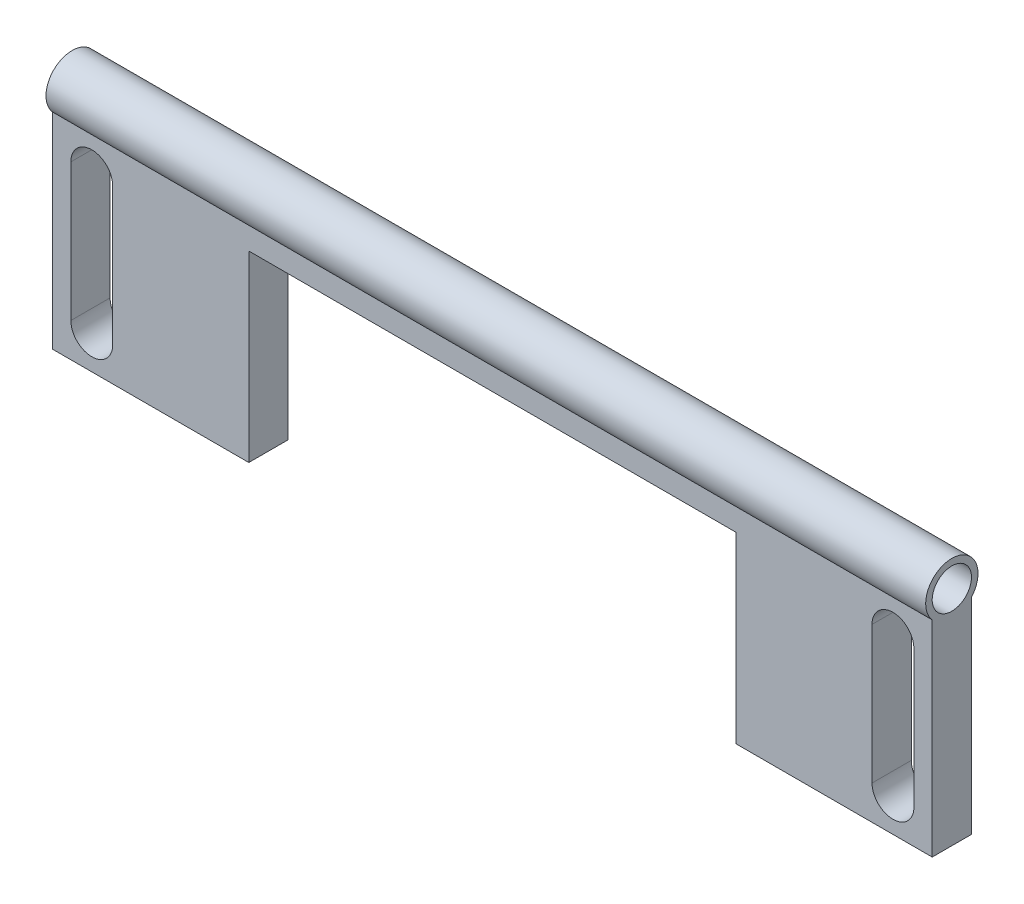
ISO-10303-21;
HEADER;
FILE_DESCRIPTION(('STEP AP214'),'2;1');
FILE_NAME('part.step','',(''),(''),'','','');
FILE_SCHEMA(('AUTOMOTIVE_DESIGN { 1 0 10303 214 1 1 1 1 }'));
ENDSEC;
DATA;
#1=APPLICATION_CONTEXT('core data for automotive mechanical design processes');
#2=APPLICATION_PROTOCOL_DEFINITION('international standard','automotive_design',2000,#1);
#3=PRODUCT_CONTEXT('',#1,'mechanical');
#4=PRODUCT('Part','Part','',(#3));
#5=PRODUCT_RELATED_PRODUCT_CATEGORY('part','',(#4));
#6=PRODUCT_DEFINITION_FORMATION('','',#4);
#7=PRODUCT_DEFINITION_CONTEXT('part definition',#1,'design');
#8=PRODUCT_DEFINITION('design','',#6,#7);
#9=PRODUCT_DEFINITION_SHAPE('','',#8);
#10=(LENGTH_UNIT() NAMED_UNIT(*) SI_UNIT(.MILLI.,.METRE.));
#11=(NAMED_UNIT(*) PLANE_ANGLE_UNIT() SI_UNIT($,.RADIAN.));
#12=(NAMED_UNIT(*) SI_UNIT($,.STERADIAN.) SOLID_ANGLE_UNIT());
#13=UNCERTAINTY_MEASURE_WITH_UNIT(LENGTH_MEASURE(1.E-05),#10,'distance_accuracy_value','');
#14=(GEOMETRIC_REPRESENTATION_CONTEXT(3) GLOBAL_UNCERTAINTY_ASSIGNED_CONTEXT((#13)) GLOBAL_UNIT_ASSIGNED_CONTEXT((#10,
#11,#12)) REPRESENTATION_CONTEXT('',''));
#15=CARTESIAN_POINT('',(0.,0.,0.));
#16=DIRECTION('',(0.,0.,1.));
#17=DIRECTION('',(1.,0.,0.));
#18=AXIS2_PLACEMENT_3D('',#15,#16,#17);
#19=CARTESIAN_POINT('',(33.615,0.,0.));
#20=DIRECTION('',(0.,1.,0.));
#21=DIRECTION('',(0.,0.,1.));
#22=AXIS2_PLACEMENT_3D('',#19,#20,#21);
#23=PLANE('',#22);
#24=DIRECTION('',(-1.,0.,0.));
#25=VECTOR('',#24,1.);
#26=CARTESIAN_POINT('',(33.615,0.,-3.));
#27=LINE('',#26,#25);
#28=CARTESIAN_POINT('',(15.,0.,-3.));
#29=VERTEX_POINT('',#28);
#30=CARTESIAN_POINT('',(0.,0.,-3.));
#31=VERTEX_POINT('',#30);
#32=EDGE_CURVE('E273',#29,#31,#27,.T.);
#33=ORIENTED_EDGE('',*,*,#32,.F.);
#34=DIRECTION('',(0.,0.,1.));
#35=VECTOR('',#34,1.);
#36=CARTESIAN_POINT('',(15.,0.,0.));
#37=LINE('',#36,#35);
#38=CARTESIAN_POINT('',(15.,0.,0.));
#39=VERTEX_POINT('',#38);
#40=EDGE_CURVE('E11',#29,#39,#37,.T.);
#41=ORIENTED_EDGE('',*,*,#40,.T.);
#42=DIRECTION('',(-1.,0.,0.));
#43=VECTOR('',#42,1.);
#44=CARTESIAN_POINT('',(33.615,0.,0.));
#45=LINE('',#44,#43);
#46=CARTESIAN_POINT('',(0.,0.,0.));
#47=VERTEX_POINT('',#46);
#48=EDGE_CURVE('E275',#39,#47,#45,.T.);
#49=ORIENTED_EDGE('',*,*,#48,.T.);
#50=DIRECTION('',(0.,0.,-1.));
#51=VECTOR('',#50,1.);
#52=CARTESIAN_POINT('',(0.,0.,0.));
#53=LINE('',#52,#51);
#54=EDGE_CURVE('E262',#47,#31,#53,.T.);
#55=ORIENTED_EDGE('',*,*,#54,.T.);
#56=EDGE_LOOP('',(#33,#41,#49,#55));
#57=FACE_BOUND('',#56,.T.);
#58=ADVANCED_FACE('F37',(#57),#23,.F.);
#59=CARTESIAN_POINT('',(33.615,0.,0.));
#60=DIRECTION('',(0.,0.,-1.));
#61=DIRECTION('',(0.,1.,0.));
#62=AXIS2_PLACEMENT_3D('',#59,#60,#61);
#63=PLANE('',#62);
#64=ORIENTED_EDGE('',*,*,#48,.F.);
#65=DIRECTION('',(0.,1.,0.));
#66=VECTOR('',#65,1.);
#67=CARTESIAN_POINT('',(15.,0.,0.));
#68=LINE('',#67,#66);
#69=CARTESIAN_POINT('',(15.,14.,0.));
#70=VERTEX_POINT('',#69);
#71=EDGE_CURVE('E176',#39,#70,#68,.T.);
#72=ORIENTED_EDGE('',*,*,#71,.T.);
#73=DIRECTION('',(1.,0.,0.));
#74=VECTOR('',#73,1.);
#75=CARTESIAN_POINT('',(33.615,14.,0.));
#76=LINE('',#75,#74);
#77=CARTESIAN_POINT('',(52.23,14.,0.));
#78=VERTEX_POINT('',#77);
#79=EDGE_CURVE('E179',#70,#78,#76,.T.);
#80=ORIENTED_EDGE('',*,*,#79,.T.);
#81=DIRECTION('',(0.,-1.,0.));
#82=VECTOR('',#81,1.);
#83=CARTESIAN_POINT('',(52.23,0.,0.));
#84=LINE('',#83,#82);
#85=CARTESIAN_POINT('',(52.23,0.,0.));
#86=VERTEX_POINT('',#85);
#87=EDGE_CURVE('E152',#78,#86,#84,.T.);
#88=ORIENTED_EDGE('',*,*,#87,.T.);
#89=CARTESIAN_POINT('',(67.23,0.,0.));
#90=VERTEX_POINT('',#89);
#91=EDGE_CURVE('E276',#90,#86,#45,.T.);
#92=ORIENTED_EDGE('',*,*,#91,.F.);
#93=DIRECTION('',(0.,-1.,0.));
#94=VECTOR('',#93,1.);
#95=CARTESIAN_POINT('',(67.23,0.,0.));
#96=LINE('',#95,#94);
#97=CARTESIAN_POINT('',(67.23,15.7,0.));
#98=VERTEX_POINT('',#97);
#99=EDGE_CURVE('E218',#98,#90,#96,.T.);
#100=ORIENTED_EDGE('',*,*,#99,.F.);
#101=DIRECTION('',(-1.,0.,0.));
#102=VECTOR('',#101,1.);
#103=CARTESIAN_POINT('',(33.615,15.7,0.));
#104=LINE('',#103,#102);
#105=CARTESIAN_POINT('',(0.,15.7,0.));
#106=VERTEX_POINT('',#105);
#107=EDGE_CURVE('E279',#98,#106,#104,.T.);
#108=ORIENTED_EDGE('',*,*,#107,.T.);
#109=DIRECTION('',(0.,-1.,0.));
#110=VECTOR('',#109,1.);
#111=CARTESIAN_POINT('',(0.,0.,0.));
#112=LINE('',#111,#110);
#113=EDGE_CURVE('E259',#106,#47,#112,.T.);
#114=ORIENTED_EDGE('',*,*,#113,.T.);
#115=EDGE_LOOP('',(#64,#72,#80,#88,#92,#100,#108,#114));
#116=FACE_BOUND('',#115,.T.);
#117=DIRECTION('',(0.,1.,0.));
#118=VECTOR('',#117,1.);
#119=CARTESIAN_POINT('',(1.40000000000001,0.,0.));
#120=LINE('',#119,#118);
#121=CARTESIAN_POINT('',(1.4,2.6,0.));
#122=VERTEX_POINT('',#121);
#123=CARTESIAN_POINT('',(1.4,13.1,0.));
#124=VERTEX_POINT('',#123);
#125=EDGE_CURVE('E250',#122,#124,#120,.T.);
#126=ORIENTED_EDGE('',*,*,#125,.T.);
#127=CARTESIAN_POINT('',(3.,13.1,0.));
#128=DIRECTION('',(0.,0.,-1.));
#129=DIRECTION('',(0.,1.,0.));
#130=AXIS2_PLACEMENT_3D('',#127,#128,#129);
#131=CIRCLE('',#130,1.6);
#132=CARTESIAN_POINT('',(4.6,13.1,0.));
#133=VERTEX_POINT('',#132);
#134=EDGE_CURVE('E253',#124,#133,#131,.T.);
#135=ORIENTED_EDGE('',*,*,#134,.T.);
#136=DIRECTION('',(0.,-1.,0.));
#137=VECTOR('',#136,1.);
#138=CARTESIAN_POINT('',(4.6,0.,0.));
#139=LINE('',#138,#137);
#140=CARTESIAN_POINT('',(4.6,2.6,0.));
#141=VERTEX_POINT('',#140);
#142=EDGE_CURVE('E238',#133,#141,#139,.T.);
#143=ORIENTED_EDGE('',*,*,#142,.T.);
#144=CARTESIAN_POINT('',(3.,2.6,0.));
#145=DIRECTION('',(0.,0.,-1.));
#146=DIRECTION('',(0.,1.,0.));
#147=AXIS2_PLACEMENT_3D('',#144,#145,#146);
#148=CIRCLE('',#147,1.6);
#149=EDGE_CURVE('E247',#141,#122,#148,.T.);
#150=ORIENTED_EDGE('',*,*,#149,.T.);
#151=EDGE_LOOP('',(#126,#135,#143,#150));
#152=FACE_BOUND('',#151,.T.);
#153=CARTESIAN_POINT('',(64.23,13.1,0.));
#154=DIRECTION('',(0.,0.,-1.));
#155=DIRECTION('',(0.,1.,0.));
#156=AXIS2_PLACEMENT_3D('',#153,#154,#155);
#157=CIRCLE('',#156,1.6);
#158=CARTESIAN_POINT('',(65.83,13.1,0.));
#159=VERTEX_POINT('',#158);
#160=CARTESIAN_POINT('',(62.63,13.1,0.));
#161=VERTEX_POINT('',#160);
#162=EDGE_CURVE('E207',#159,#161,#157,.F.);
#163=ORIENTED_EDGE('',*,*,#162,.F.);
#164=DIRECTION('',(0.,1.,0.));
#165=VECTOR('',#164,1.);
#166=CARTESIAN_POINT('',(65.83,0.,0.));
#167=LINE('',#166,#165);
#168=CARTESIAN_POINT('',(65.83,2.6,0.));
#169=VERTEX_POINT('',#168);
#170=EDGE_CURVE('E196',#169,#159,#167,.T.);
#171=ORIENTED_EDGE('',*,*,#170,.F.);
#172=CARTESIAN_POINT('',(64.23,2.6,0.));
#173=DIRECTION('',(0.,0.,-1.));
#174=DIRECTION('',(0.,1.,0.));
#175=AXIS2_PLACEMENT_3D('',#172,#173,#174);
#176=CIRCLE('',#175,1.6);
#177=CARTESIAN_POINT('',(62.63,2.6,0.));
#178=VERTEX_POINT('',#177);
#179=EDGE_CURVE('E203',#178,#169,#176,.F.);
#180=ORIENTED_EDGE('',*,*,#179,.F.);
#181=DIRECTION('',(0.,-1.,0.));
#182=VECTOR('',#181,1.);
#183=CARTESIAN_POINT('',(62.63,0.,0.));
#184=LINE('',#183,#182);
#185=EDGE_CURVE('E205',#161,#178,#184,.T.);
#186=ORIENTED_EDGE('',*,*,#185,.F.);
#187=EDGE_LOOP('',(#163,#171,#180,#186));
#188=FACE_BOUND('',#187,.T.);
#189=ADVANCED_FACE('F285',(#116,#152,#188),#63,.F.);
#190=CARTESIAN_POINT('',(33.615,0.,-3.));
#191=DIRECTION('',(0.,0.,1.));
#192=DIRECTION('',(1.,0.,0.));
#193=AXIS2_PLACEMENT_3D('',#190,#191,#192);
#194=PLANE('',#193);
#195=DIRECTION('',(1.,0.,0.));
#196=VECTOR('',#195,1.);
#197=CARTESIAN_POINT('',(52.23,14.,-3.));
#198=LINE('',#197,#196);
#199=CARTESIAN_POINT('',(15.,14.,-3.));
#200=VERTEX_POINT('',#199);
#201=CARTESIAN_POINT('',(52.23,14.,-3.));
#202=VERTEX_POINT('',#201);
#203=EDGE_CURVE('E159',#200,#202,#198,.T.);
#204=ORIENTED_EDGE('',*,*,#203,.F.);
#205=DIRECTION('',(0.,1.,0.));
#206=VECTOR('',#205,1.);
#207=CARTESIAN_POINT('',(15.,14.,-3.));
#208=LINE('',#207,#206);
#209=EDGE_CURVE('E156',#29,#200,#208,.T.);
#210=ORIENTED_EDGE('',*,*,#209,.F.);
#211=ORIENTED_EDGE('',*,*,#32,.T.);
#212=DIRECTION('',(0.,1.,0.));
#213=VECTOR('',#212,1.);
#214=CARTESIAN_POINT('',(0.,0.,-3.));
#215=LINE('',#214,#213);
#216=CARTESIAN_POINT('',(0.,15.7,-3.));
#217=VERTEX_POINT('',#216);
#218=EDGE_CURVE('E265',#31,#217,#215,.T.);
#219=ORIENTED_EDGE('',*,*,#218,.T.);
#220=DIRECTION('',(-1.,0.,0.));
#221=VECTOR('',#220,1.);
#222=CARTESIAN_POINT('',(33.615,15.7,-3.));
#223=LINE('',#222,#221);
#224=CARTESIAN_POINT('',(67.23,15.7,-3.));
#225=VERTEX_POINT('',#224);
#226=EDGE_CURVE('E271',#225,#217,#223,.T.);
#227=ORIENTED_EDGE('',*,*,#226,.F.);
#228=DIRECTION('',(0.,1.,0.));
#229=VECTOR('',#228,1.);
#230=CARTESIAN_POINT('',(67.23,0.,-3.));
#231=LINE('',#230,#229);
#232=CARTESIAN_POINT('',(67.23,0.,-3.));
#233=VERTEX_POINT('',#232);
#234=EDGE_CURVE('E212',#233,#225,#231,.T.);
#235=ORIENTED_EDGE('',*,*,#234,.F.);
#236=CARTESIAN_POINT('',(52.23,0.,-3.));
#237=VERTEX_POINT('',#236);
#238=EDGE_CURVE('E170',#233,#237,#27,.T.);
#239=ORIENTED_EDGE('',*,*,#238,.T.);
#240=DIRECTION('',(0.,-1.,0.));
#241=VECTOR('',#240,1.);
#242=CARTESIAN_POINT('',(52.23,14.,-3.));
#243=LINE('',#242,#241);
#244=EDGE_CURVE('E52',#202,#237,#243,.T.);
#245=ORIENTED_EDGE('',*,*,#244,.F.);
#246=EDGE_LOOP('',(#204,#210,#211,#219,#227,#235,#239,#245));
#247=FACE_BOUND('',#246,.T.);
#248=DIRECTION('',(0.,-1.,0.));
#249=VECTOR('',#248,1.);
#250=CARTESIAN_POINT('',(4.6,13.1,-3.));
#251=LINE('',#250,#249);
#252=CARTESIAN_POINT('',(4.6,13.1,-3.));
#253=VERTEX_POINT('',#252);
#254=CARTESIAN_POINT('',(4.6,2.6,-3.));
#255=VERTEX_POINT('',#254);
#256=EDGE_CURVE('E226',#253,#255,#251,.T.);
#257=ORIENTED_EDGE('',*,*,#256,.F.);
#258=CARTESIAN_POINT('',(3.,13.1,-3.));
#259=DIRECTION('',(0.,0.,-1.));
#260=DIRECTION('',(-1.,0.,0.));
#261=AXIS2_PLACEMENT_3D('',#258,#259,#260);
#262=CIRCLE('',#261,1.6);
#263=CARTESIAN_POINT('',(1.4,13.1,-3.));
#264=VERTEX_POINT('',#263);
#265=EDGE_CURVE('E224',#264,#253,#262,.T.);
#266=ORIENTED_EDGE('',*,*,#265,.F.);
#267=DIRECTION('',(0.,1.,0.));
#268=VECTOR('',#267,1.);
#269=CARTESIAN_POINT('',(1.4,13.1,-3.));
#270=LINE('',#269,#268);
#271=CARTESIAN_POINT('',(1.4,2.6,-3.));
#272=VERTEX_POINT('',#271);
#273=EDGE_CURVE('E232',#272,#264,#270,.T.);
#274=ORIENTED_EDGE('',*,*,#273,.F.);
#275=CARTESIAN_POINT('',(3.,2.6,-3.));
#276=DIRECTION('',(0.,0.,-1.));
#277=DIRECTION('',(-1.,0.,0.));
#278=AXIS2_PLACEMENT_3D('',#275,#276,#277);
#279=CIRCLE('',#278,1.6);
#280=EDGE_CURVE('E229',#255,#272,#279,.T.);
#281=ORIENTED_EDGE('',*,*,#280,.F.);
#282=EDGE_LOOP('',(#257,#266,#274,#281));
#283=FACE_BOUND('',#282,.T.);
#284=CARTESIAN_POINT('',(64.23,13.1,-3.));
#285=DIRECTION('',(0.,0.,1.));
#286=DIRECTION('',(1.,0.,0.));
#287=AXIS2_PLACEMENT_3D('',#284,#285,#286);
#288=CIRCLE('',#287,1.6);
#289=CARTESIAN_POINT('',(65.83,13.1,-3.));
#290=VERTEX_POINT('',#289);
#291=CARTESIAN_POINT('',(62.63,13.1,-3.));
#292=VERTEX_POINT('',#291);
#293=EDGE_CURVE('E181',#290,#292,#288,.T.);
#294=ORIENTED_EDGE('',*,*,#293,.T.);
#295=DIRECTION('',(0.,-1.,0.));
#296=VECTOR('',#295,1.);
#297=CARTESIAN_POINT('',(62.63,13.1,-3.));
#298=LINE('',#297,#296);
#299=CARTESIAN_POINT('',(62.63,2.6,-3.));
#300=VERTEX_POINT('',#299);
#301=EDGE_CURVE('E190',#292,#300,#298,.T.);
#302=ORIENTED_EDGE('',*,*,#301,.T.);
#303=CARTESIAN_POINT('',(64.23,2.6,-3.));
#304=DIRECTION('',(0.,0.,1.));
#305=DIRECTION('',(1.,0.,0.));
#306=AXIS2_PLACEMENT_3D('',#303,#304,#305);
#307=CIRCLE('',#306,1.6);
#308=CARTESIAN_POINT('',(65.83,2.6,-3.));
#309=VERTEX_POINT('',#308);
#310=EDGE_CURVE('E187',#300,#309,#307,.T.);
#311=ORIENTED_EDGE('',*,*,#310,.T.);
#312=DIRECTION('',(0.,1.,0.));
#313=VECTOR('',#312,1.);
#314=CARTESIAN_POINT('',(65.83,13.1,-3.));
#315=LINE('',#314,#313);
#316=EDGE_CURVE('E184',#309,#290,#315,.T.);
#317=ORIENTED_EDGE('',*,*,#316,.T.);
#318=EDGE_LOOP('',(#294,#302,#311,#317));
#319=FACE_BOUND('',#318,.T.);
#320=ADVANCED_FACE('F167',(#247,#283,#319),#194,.F.);
#321=CARTESIAN_POINT('',(33.615,17.0228756555323,-1.5));
#322=DIRECTION('',(-1.,0.,0.));
#323=DIRECTION('',(0.,0.,1.));
#324=AXIS2_PLACEMENT_3D('',#321,#322,#323);
#325=CYLINDRICAL_SURFACE('',#324,2.);
#326=CARTESIAN_POINT('',(0.,17.0228756555323,-1.5));
#327=DIRECTION('',(1.,0.,0.));
#328=DIRECTION('',(0.,0.,-1.));
#329=AXIS2_PLACEMENT_3D('',#326,#327,#328);
#330=CIRCLE('',#329,2.);
#331=EDGE_CURVE('E256',#106,#217,#330,.F.);
#332=ORIENTED_EDGE('',*,*,#331,.F.);
#333=ORIENTED_EDGE('',*,*,#107,.F.);
#334=CARTESIAN_POINT('',(67.23,17.0228756555323,-1.5));
#335=DIRECTION('',(1.,0.,0.));
#336=DIRECTION('',(0.,0.,-1.));
#337=AXIS2_PLACEMENT_3D('',#334,#335,#336);
#338=CIRCLE('',#337,2.);
#339=EDGE_CURVE('E209',#98,#225,#338,.F.);
#340=ORIENTED_EDGE('',*,*,#339,.T.);
#341=ORIENTED_EDGE('',*,*,#226,.T.);
#342=EDGE_LOOP('',(#332,#333,#340,#341));
#343=FACE_BOUND('',#342,.T.);
#344=ADVANCED_FACE('F39',(#343),#325,.T.);
#345=ORIENTED_EDGE('',*,*,#91,.T.);
#346=DIRECTION('',(0.,0.,-1.));
#347=VECTOR('',#346,1.);
#348=CARTESIAN_POINT('',(52.23,0.,0.));
#349=LINE('',#348,#347);
#350=EDGE_CURVE('E45',#86,#237,#349,.T.);
#351=ORIENTED_EDGE('',*,*,#350,.T.);
#352=ORIENTED_EDGE('',*,*,#238,.F.);
#353=DIRECTION('',(0.,0.,-1.));
#354=VECTOR('',#353,1.);
#355=CARTESIAN_POINT('',(67.23,0.,0.));
#356=LINE('',#355,#354);
#357=EDGE_CURVE('E215',#90,#233,#356,.T.);
#358=ORIENTED_EDGE('',*,*,#357,.F.);
#359=EDGE_LOOP('',(#345,#351,#352,#358));
#360=FACE_BOUND('',#359,.T.);
#361=ADVANCED_FACE('F281',(#360),#23,.F.);
#362=CARTESIAN_POINT('',(33.615,17.0228756555323,-1.5));
#363=DIRECTION('',(-1.,0.,0.));
#364=DIRECTION('',(0.,0.,1.));
#365=AXIS2_PLACEMENT_3D('',#362,#363,#364);
#366=CYLINDRICAL_SURFACE('',#365,1.5);
#367=CARTESIAN_POINT('',(0.,17.0228756555323,-1.5));
#368=DIRECTION('',(1.,0.,0.));
#369=DIRECTION('',(0.,0.,-1.));
#370=AXIS2_PLACEMENT_3D('',#367,#368,#369);
#371=CIRCLE('',#370,1.5);
#372=CARTESIAN_POINT('',(0.,17.0228756555323,-3.));
#373=VERTEX_POINT('',#372);
#374=EDGE_CURVE('E268',#373,#373,#371,.T.);
#375=ORIENTED_EDGE('',*,*,#374,.F.);
#376=EDGE_LOOP('',(#375));
#377=FACE_BOUND('',#376,.T.);
#378=CARTESIAN_POINT('',(67.23,17.0228756555323,-1.5));
#379=DIRECTION('',(1.,0.,0.));
#380=DIRECTION('',(0.,0.,-1.));
#381=AXIS2_PLACEMENT_3D('',#378,#379,#380);
#382=CIRCLE('',#381,1.5);
#383=CARTESIAN_POINT('',(67.23,17.0228756555323,-3.));
#384=VERTEX_POINT('',#383);
#385=EDGE_CURVE('E221',#384,#384,#382,.T.);
#386=ORIENTED_EDGE('',*,*,#385,.T.);
#387=EDGE_LOOP('',(#386));
#388=FACE_BOUND('',#387,.T.);
#389=ADVANCED_FACE('F310',(#377,#388),#366,.F.);
#390=CARTESIAN_POINT('',(0.,0.,0.));
#391=DIRECTION('',(1.,0.,0.));
#392=DIRECTION('',(0.,0.,-1.));
#393=AXIS2_PLACEMENT_3D('',#390,#391,#392);
#394=PLANE('',#393);
#395=ORIENTED_EDGE('',*,*,#331,.T.);
#396=ORIENTED_EDGE('',*,*,#218,.F.);
#397=ORIENTED_EDGE('',*,*,#54,.F.);
#398=ORIENTED_EDGE('',*,*,#113,.F.);
#399=EDGE_LOOP('',(#395,#396,#397,#398));
#400=FACE_BOUND('',#399,.T.);
#401=ORIENTED_EDGE('',*,*,#374,.T.);
#402=EDGE_LOOP('',(#401));
#403=FACE_BOUND('',#402,.T.);
#404=ADVANCED_FACE('F296',(#400,#403),#394,.F.);
#405=CARTESIAN_POINT('',(3.,13.1,0.5));
#406=DIRECTION('',(0.,0.,-1.));
#407=DIRECTION('',(-1.,0.,0.));
#408=AXIS2_PLACEMENT_3D('',#405,#406,#407);
#409=CYLINDRICAL_SURFACE('',#408,1.6);
#410=DIRECTION('',(0.,0.,-1.));
#411=VECTOR('',#410,1.);
#412=CARTESIAN_POINT('',(1.4,13.1,0.5));
#413=LINE('',#412,#411);
#414=EDGE_CURVE('E236',#124,#264,#413,.T.);
#415=ORIENTED_EDGE('',*,*,#414,.T.);
#416=ORIENTED_EDGE('',*,*,#265,.T.);
#417=DIRECTION('',(0.,0.,-1.));
#418=VECTOR('',#417,1.);
#419=CARTESIAN_POINT('',(4.6,13.1,0.5));
#420=LINE('',#419,#418);
#421=EDGE_CURVE('E235',#133,#253,#420,.T.);
#422=ORIENTED_EDGE('',*,*,#421,.F.);
#423=ORIENTED_EDGE('',*,*,#134,.F.);
#424=EDGE_LOOP('',(#415,#416,#422,#423));
#425=FACE_BOUND('',#424,.T.);
#426=ADVANCED_FACE('F318',(#425),#409,.F.);
#427=CARTESIAN_POINT('',(1.4,13.1,0.5));
#428=DIRECTION('',(-1.,0.,0.));
#429=DIRECTION('',(0.,-1.,0.));
#430=AXIS2_PLACEMENT_3D('',#427,#428,#429);
#431=PLANE('',#430);
#432=DIRECTION('',(0.,0.,-1.));
#433=VECTOR('',#432,1.);
#434=CARTESIAN_POINT('',(1.4,2.6,0.5));
#435=LINE('',#434,#433);
#436=EDGE_CURVE('E239',#122,#272,#435,.T.);
#437=ORIENTED_EDGE('',*,*,#436,.T.);
#438=ORIENTED_EDGE('',*,*,#273,.T.);
#439=ORIENTED_EDGE('',*,*,#414,.F.);
#440=ORIENTED_EDGE('',*,*,#125,.F.);
#441=EDGE_LOOP('',(#437,#438,#439,#440));
#442=FACE_BOUND('',#441,.T.);
#443=ADVANCED_FACE('F387',(#442),#431,.F.);
#444=CARTESIAN_POINT('',(3.,2.6,0.5));
#445=DIRECTION('',(0.,0.,-1.));
#446=DIRECTION('',(-1.,0.,0.));
#447=AXIS2_PLACEMENT_3D('',#444,#445,#446);
#448=CYLINDRICAL_SURFACE('',#447,1.6);
#449=DIRECTION('',(0.,0.,-1.));
#450=VECTOR('',#449,1.);
#451=CARTESIAN_POINT('',(4.6,2.6,0.5));
#452=LINE('',#451,#450);
#453=EDGE_CURVE('E241',#141,#255,#452,.T.);
#454=ORIENTED_EDGE('',*,*,#453,.T.);
#455=ORIENTED_EDGE('',*,*,#280,.T.);
#456=ORIENTED_EDGE('',*,*,#436,.F.);
#457=ORIENTED_EDGE('',*,*,#149,.F.);
#458=EDGE_LOOP('',(#454,#455,#456,#457));
#459=FACE_BOUND('',#458,.T.);
#460=ADVANCED_FACE('F390',(#459),#448,.F.);
#461=CARTESIAN_POINT('',(4.6,13.1,0.5));
#462=DIRECTION('',(1.,0.,0.));
#463=DIRECTION('',(0.,1.,0.));
#464=AXIS2_PLACEMENT_3D('',#461,#462,#463);
#465=PLANE('',#464);
#466=ORIENTED_EDGE('',*,*,#421,.T.);
#467=ORIENTED_EDGE('',*,*,#256,.T.);
#468=ORIENTED_EDGE('',*,*,#453,.F.);
#469=ORIENTED_EDGE('',*,*,#142,.F.);
#470=EDGE_LOOP('',(#466,#467,#468,#469));
#471=FACE_BOUND('',#470,.T.);
#472=ADVANCED_FACE('F306',(#471),#465,.F.);
#473=CARTESIAN_POINT('',(67.23,0.,0.));
#474=DIRECTION('',(-1.,0.,0.));
#475=DIRECTION('',(0.,0.,-1.));
#476=AXIS2_PLACEMENT_3D('',#473,#474,#475);
#477=PLANE('',#476);
#478=ORIENTED_EDGE('',*,*,#339,.F.);
#479=ORIENTED_EDGE('',*,*,#99,.T.);
#480=ORIENTED_EDGE('',*,*,#357,.T.);
#481=ORIENTED_EDGE('',*,*,#234,.T.);
#482=EDGE_LOOP('',(#478,#479,#480,#481));
#483=FACE_BOUND('',#482,.T.);
#484=ORIENTED_EDGE('',*,*,#385,.F.);
#485=EDGE_LOOP('',(#484));
#486=FACE_BOUND('',#485,.T.);
#487=ADVANCED_FACE('F302',(#483,#486),#477,.F.);
#488=CARTESIAN_POINT('',(64.23,13.1,0.5));
#489=DIRECTION('',(0.,0.,-1.));
#490=DIRECTION('',(-1.,0.,0.));
#491=AXIS2_PLACEMENT_3D('',#488,#489,#490);
#492=CYLINDRICAL_SURFACE('',#491,1.6);
#493=ORIENTED_EDGE('',*,*,#162,.T.);
#494=DIRECTION('',(0.,0.,-1.));
#495=VECTOR('',#494,1.);
#496=CARTESIAN_POINT('',(62.63,13.1,0.5));
#497=LINE('',#496,#495);
#498=EDGE_CURVE('E194',#161,#292,#497,.T.);
#499=ORIENTED_EDGE('',*,*,#498,.T.);
#500=ORIENTED_EDGE('',*,*,#293,.F.);
#501=DIRECTION('',(0.,0.,-1.));
#502=VECTOR('',#501,1.);
#503=CARTESIAN_POINT('',(65.83,13.1,0.5));
#504=LINE('',#503,#502);
#505=EDGE_CURVE('E193',#159,#290,#504,.T.);
#506=ORIENTED_EDGE('',*,*,#505,.F.);
#507=EDGE_LOOP('',(#493,#499,#500,#506));
#508=FACE_BOUND('',#507,.T.);
#509=ADVANCED_FACE('F305',(#508),#492,.F.);
#510=CARTESIAN_POINT('',(62.63,13.1,0.5));
#511=DIRECTION('',(1.,0.,0.));
#512=DIRECTION('',(0.,1.,0.));
#513=AXIS2_PLACEMENT_3D('',#510,#511,#512);
#514=PLANE('',#513);
#515=ORIENTED_EDGE('',*,*,#185,.T.);
#516=DIRECTION('',(0.,0.,-1.));
#517=VECTOR('',#516,1.);
#518=CARTESIAN_POINT('',(62.63,2.6,0.5));
#519=LINE('',#518,#517);
#520=EDGE_CURVE('E197',#178,#300,#519,.T.);
#521=ORIENTED_EDGE('',*,*,#520,.T.);
#522=ORIENTED_EDGE('',*,*,#301,.F.);
#523=ORIENTED_EDGE('',*,*,#498,.F.);
#524=EDGE_LOOP('',(#515,#521,#522,#523));
#525=FACE_BOUND('',#524,.T.);
#526=ADVANCED_FACE('F375',(#525),#514,.T.);
#527=CARTESIAN_POINT('',(64.23,2.6,0.5));
#528=DIRECTION('',(0.,0.,-1.));
#529=DIRECTION('',(-1.,0.,0.));
#530=AXIS2_PLACEMENT_3D('',#527,#528,#529);
#531=CYLINDRICAL_SURFACE('',#530,1.6);
#532=ORIENTED_EDGE('',*,*,#179,.T.);
#533=DIRECTION('',(0.,0.,-1.));
#534=VECTOR('',#533,1.);
#535=CARTESIAN_POINT('',(65.83,2.6,0.5));
#536=LINE('',#535,#534);
#537=EDGE_CURVE('E60',#169,#309,#536,.T.);
#538=ORIENTED_EDGE('',*,*,#537,.T.);
#539=ORIENTED_EDGE('',*,*,#310,.F.);
#540=ORIENTED_EDGE('',*,*,#520,.F.);
#541=EDGE_LOOP('',(#532,#538,#539,#540));
#542=FACE_BOUND('',#541,.T.);
#543=ADVANCED_FACE('F378',(#542),#531,.F.);
#544=CARTESIAN_POINT('',(65.83,13.1,0.5));
#545=DIRECTION('',(-1.,0.,0.));
#546=DIRECTION('',(0.,-1.,0.));
#547=AXIS2_PLACEMENT_3D('',#544,#545,#546);
#548=PLANE('',#547);
#549=ORIENTED_EDGE('',*,*,#170,.T.);
#550=ORIENTED_EDGE('',*,*,#505,.T.);
#551=ORIENTED_EDGE('',*,*,#316,.F.);
#552=ORIENTED_EDGE('',*,*,#537,.F.);
#553=EDGE_LOOP('',(#549,#550,#551,#552));
#554=FACE_BOUND('',#553,.T.);
#555=ADVANCED_FACE('F352',(#554),#548,.T.);
#556=CARTESIAN_POINT('',(52.23,14.,7.));
#557=DIRECTION('',(0.,1.,0.));
#558=DIRECTION('',(0.,0.,1.));
#559=AXIS2_PLACEMENT_3D('',#556,#557,#558);
#560=PLANE('',#559);
#561=DIRECTION('',(0.,0.,-1.));
#562=VECTOR('',#561,1.);
#563=CARTESIAN_POINT('',(15.,14.,7.));
#564=LINE('',#563,#562);
#565=EDGE_CURVE('E155',#70,#200,#564,.T.);
#566=ORIENTED_EDGE('',*,*,#565,.T.);
#567=ORIENTED_EDGE('',*,*,#203,.T.);
#568=DIRECTION('',(0.,0.,-1.));
#569=VECTOR('',#568,1.);
#570=CARTESIAN_POINT('',(52.23,14.,7.));
#571=LINE('',#570,#569);
#572=EDGE_CURVE('E148',#78,#202,#571,.T.);
#573=ORIENTED_EDGE('',*,*,#572,.F.);
#574=ORIENTED_EDGE('',*,*,#79,.F.);
#575=EDGE_LOOP('',(#566,#567,#573,#574));
#576=FACE_BOUND('',#575,.T.);
#577=ADVANCED_FACE('F160',(#576),#560,.F.);
#578=CARTESIAN_POINT('',(15.,14.,7.));
#579=DIRECTION('',(-1.,0.,0.));
#580=DIRECTION('',(0.,0.,1.));
#581=AXIS2_PLACEMENT_3D('',#578,#579,#580);
#582=PLANE('',#581);
#583=ORIENTED_EDGE('',*,*,#40,.F.);
#584=ORIENTED_EDGE('',*,*,#209,.T.);
#585=ORIENTED_EDGE('',*,*,#565,.F.);
#586=ORIENTED_EDGE('',*,*,#71,.F.);
#587=EDGE_LOOP('',(#583,#584,#585,#586));
#588=FACE_BOUND('',#587,.T.);
#589=ADVANCED_FACE('F289',(#588),#582,.F.);
#590=CARTESIAN_POINT('',(52.23,14.,7.));
#591=DIRECTION('',(1.,0.,0.));
#592=DIRECTION('',(0.,0.,-1.));
#593=AXIS2_PLACEMENT_3D('',#590,#591,#592);
#594=PLANE('',#593);
#595=ORIENTED_EDGE('',*,*,#572,.T.);
#596=ORIENTED_EDGE('',*,*,#244,.T.);
#597=ORIENTED_EDGE('',*,*,#350,.F.);
#598=ORIENTED_EDGE('',*,*,#87,.F.);
#599=EDGE_LOOP('',(#595,#596,#597,#598));
#600=FACE_BOUND('',#599,.T.);
#601=ADVANCED_FACE('F150',(#600),#594,.F.);
#602=CLOSED_SHELL('',(#58,#189,#320,#344,#361,#389,#404,#426,#443,#460,#472,#487,#509,#526,#543,
#555,#577,#589,#601));
#603=MANIFOLD_SOLID_BREP('B2',#602);
#604=ADVANCED_BREP_SHAPE_REPRESENTATION('',(#18,#603),#14);
#605=SHAPE_DEFINITION_REPRESENTATION(#9,#604);
ENDSEC;
END-ISO-10303-21;
